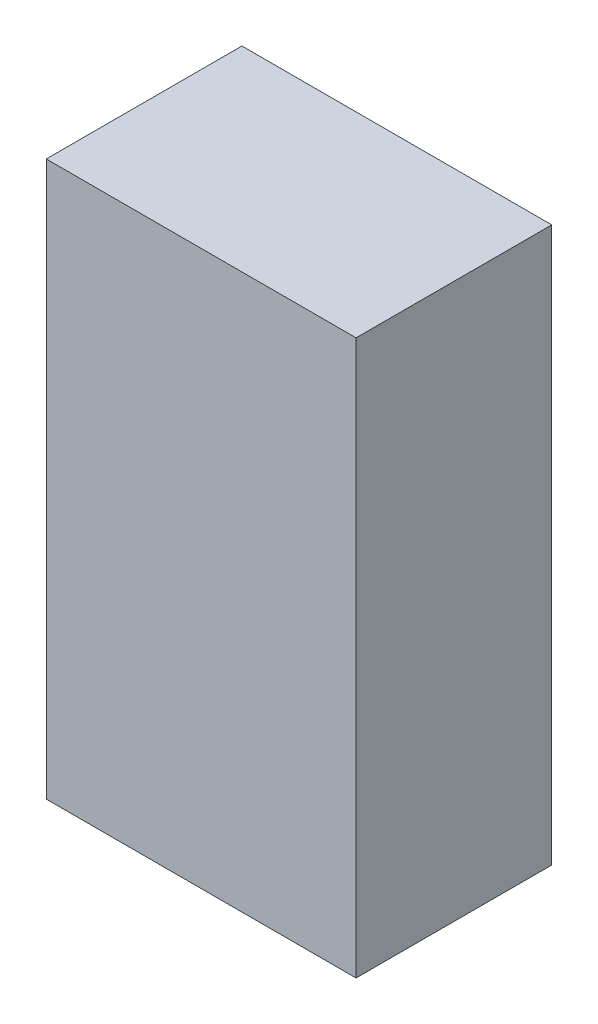
ISO-10303-21;
HEADER;
FILE_DESCRIPTION(('STEP AP214'),'2;1');
FILE_NAME('part.step','',(''),(''),'','','');
FILE_SCHEMA(('AUTOMOTIVE_DESIGN { 1 0 10303 214 1 1 1 1 }'));
ENDSEC;
DATA;
#1=APPLICATION_CONTEXT('core data for automotive mechanical design processes');
#2=APPLICATION_PROTOCOL_DEFINITION('international standard','automotive_design',2000,#1);
#3=PRODUCT_CONTEXT('',#1,'mechanical');
#4=PRODUCT('Part','Part','',(#3));
#5=PRODUCT_RELATED_PRODUCT_CATEGORY('part','',(#4));
#6=PRODUCT_DEFINITION_FORMATION('','',#4);
#7=PRODUCT_DEFINITION_CONTEXT('part definition',#1,'design');
#8=PRODUCT_DEFINITION('design','',#6,#7);
#9=PRODUCT_DEFINITION_SHAPE('','',#8);
#10=(LENGTH_UNIT() NAMED_UNIT(*) SI_UNIT(.MILLI.,.METRE.));
#11=(NAMED_UNIT(*) PLANE_ANGLE_UNIT() SI_UNIT($,.RADIAN.));
#12=(NAMED_UNIT(*) SI_UNIT($,.STERADIAN.) SOLID_ANGLE_UNIT());
#13=UNCERTAINTY_MEASURE_WITH_UNIT(LENGTH_MEASURE(1.E-05),#10,'distance_accuracy_value','');
#14=(GEOMETRIC_REPRESENTATION_CONTEXT(3) GLOBAL_UNCERTAINTY_ASSIGNED_CONTEXT((#13)) GLOBAL_UNIT_ASSIGNED_CONTEXT((#10,
#11,#12)) REPRESENTATION_CONTEXT('',''));
#15=CARTESIAN_POINT('',(0.,0.,0.));
#16=DIRECTION('',(0.,0.,1.));
#17=DIRECTION('',(1.,0.,0.));
#18=AXIS2_PLACEMENT_3D('',#15,#16,#17);
#19=CARTESIAN_POINT('',(0.47500032,0.85000084,0.6));
#20=DIRECTION('',(0.,0.,1.));
#21=DIRECTION('',(1.,0.,0.));
#22=AXIS2_PLACEMENT_3D('',#19,#20,#21);
#23=PLANE('',#22);
#24=DIRECTION('',(0.,1.,0.));
#25=VECTOR('',#24,1.);
#26=CARTESIAN_POINT('',(-0.47500032,-0.85000084,0.6));
#27=LINE('',#26,#25);
#28=CARTESIAN_POINT('',(-0.47500032,-0.85000084,0.6));
#29=VERTEX_POINT('',#28);
#30=CARTESIAN_POINT('',(-0.47500032,0.85000084,0.6));
#31=VERTEX_POINT('',#30);
#32=EDGE_CURVE('E58',#29,#31,#27,.T.);
#33=ORIENTED_EDGE('',*,*,#32,.F.);
#34=DIRECTION('',(1.,0.,0.));
#35=VECTOR('',#34,1.);
#36=CARTESIAN_POINT('',(0.47500032,-0.85000084,0.6));
#37=LINE('',#36,#35);
#38=CARTESIAN_POINT('',(0.47500032,-0.85000084,0.6));
#39=VERTEX_POINT('',#38);
#40=EDGE_CURVE('E53',#39,#29,#37,.F.);
#41=ORIENTED_EDGE('',*,*,#40,.F.);
#42=DIRECTION('',(0.,1.,0.));
#43=VECTOR('',#42,1.);
#44=CARTESIAN_POINT('',(0.47500032,0.85000084,0.6));
#45=LINE('',#44,#43);
#46=CARTESIAN_POINT('',(0.47500032,0.85000084,0.6));
#47=VERTEX_POINT('',#46);
#48=EDGE_CURVE('E68',#47,#39,#45,.F.);
#49=ORIENTED_EDGE('',*,*,#48,.F.);
#50=DIRECTION('',(1.,0.,0.));
#51=VECTOR('',#50,1.);
#52=CARTESIAN_POINT('',(-0.47500032,0.85000084,0.6));
#53=LINE('',#52,#51);
#54=EDGE_CURVE('E20',#31,#47,#53,.T.);
#55=ORIENTED_EDGE('',*,*,#54,.F.);
#56=EDGE_LOOP('',(#33,#41,#49,#55));
#57=FACE_BOUND('',#56,.T.);
#58=ADVANCED_FACE('F17',(#57),#23,.T.);
#59=CARTESIAN_POINT('',(-0.47500032,0.85000084,0.));
#60=DIRECTION('',(0.,1.,0.));
#61=DIRECTION('',(0.,0.,1.));
#62=AXIS2_PLACEMENT_3D('',#59,#60,#61);
#63=PLANE('',#62);
#64=DIRECTION('',(0.,0.,-1.));
#65=VECTOR('',#64,1.);
#66=CARTESIAN_POINT('',(0.47500032,0.85000084,0.));
#67=LINE('',#66,#65);
#68=CARTESIAN_POINT('',(0.47500032,0.85000084,0.));
#69=VERTEX_POINT('',#68);
#70=EDGE_CURVE('E79',#69,#47,#67,.F.);
#71=ORIENTED_EDGE('',*,*,#70,.F.);
#72=DIRECTION('',(1.,0.,0.));
#73=VECTOR('',#72,1.);
#74=CARTESIAN_POINT('',(0.47500032,0.85000084,0.));
#75=LINE('',#74,#73);
#76=CARTESIAN_POINT('',(-0.47500032,0.85000084,0.));
#77=VERTEX_POINT('',#76);
#78=EDGE_CURVE('E74',#69,#77,#75,.F.);
#79=ORIENTED_EDGE('',*,*,#78,.T.);
#80=DIRECTION('',(0.,0.,1.));
#81=VECTOR('',#80,1.);
#82=CARTESIAN_POINT('',(-0.47500032,0.85000084,0.));
#83=LINE('',#82,#81);
#84=EDGE_CURVE('E63',#31,#77,#83,.F.);
#85=ORIENTED_EDGE('',*,*,#84,.F.);
#86=ORIENTED_EDGE('',*,*,#54,.T.);
#87=EDGE_LOOP('',(#71,#79,#85,#86));
#88=FACE_BOUND('',#87,.T.);
#89=ADVANCED_FACE('F73',(#88),#63,.T.);
#90=CARTESIAN_POINT('',(-0.47500032,-0.85000084,0.));
#91=DIRECTION('',(-1.,0.,0.));
#92=DIRECTION('',(0.,0.,1.));
#93=AXIS2_PLACEMENT_3D('',#90,#91,#92);
#94=PLANE('',#93);
#95=ORIENTED_EDGE('',*,*,#84,.T.);
#96=DIRECTION('',(0.,1.,0.));
#97=VECTOR('',#96,1.);
#98=CARTESIAN_POINT('',(-0.47500032,0.85000084,0.));
#99=LINE('',#98,#97);
#100=CARTESIAN_POINT('',(-0.47500032,-0.85000084,0.));
#101=VERTEX_POINT('',#100);
#102=EDGE_CURVE('E84',#77,#101,#99,.F.);
#103=ORIENTED_EDGE('',*,*,#102,.T.);
#104=DIRECTION('',(0.,0.,-1.));
#105=VECTOR('',#104,1.);
#106=CARTESIAN_POINT('',(-0.47500032,-0.85000084,0.));
#107=LINE('',#106,#105);
#108=EDGE_CURVE('E65',#29,#101,#107,.T.);
#109=ORIENTED_EDGE('',*,*,#108,.F.);
#110=ORIENTED_EDGE('',*,*,#32,.T.);
#111=EDGE_LOOP('',(#95,#103,#109,#110));
#112=FACE_BOUND('',#111,.T.);
#113=ADVANCED_FACE('F60',(#112),#94,.T.);
#114=CARTESIAN_POINT('',(0.47500032,-0.85000084,0.));
#115=DIRECTION('',(0.,-1.,0.));
#116=DIRECTION('',(0.,0.,-1.));
#117=AXIS2_PLACEMENT_3D('',#114,#115,#116);
#118=PLANE('',#117);
#119=ORIENTED_EDGE('',*,*,#108,.T.);
#120=DIRECTION('',(1.,0.,0.));
#121=VECTOR('',#120,1.);
#122=CARTESIAN_POINT('',(0.47500032,-0.85000084,0.));
#123=LINE('',#122,#121);
#124=CARTESIAN_POINT('',(0.47500032,-0.85000084,0.));
#125=VERTEX_POINT('',#124);
#126=EDGE_CURVE('E26',#101,#125,#123,.T.);
#127=ORIENTED_EDGE('',*,*,#126,.T.);
#128=DIRECTION('',(0.,0.,-1.));
#129=VECTOR('',#128,1.);
#130=CARTESIAN_POINT('',(0.47500032,-0.85000084,0.));
#131=LINE('',#130,#129);
#132=EDGE_CURVE('E34',#39,#125,#131,.T.);
#133=ORIENTED_EDGE('',*,*,#132,.F.);
#134=ORIENTED_EDGE('',*,*,#40,.T.);
#135=EDGE_LOOP('',(#119,#127,#133,#134));
#136=FACE_BOUND('',#135,.T.);
#137=ADVANCED_FACE('F88',(#136),#118,.T.);
#138=CARTESIAN_POINT('',(0.47500032,0.85000084,0.));
#139=DIRECTION('',(1.,0.,0.));
#140=DIRECTION('',(0.,0.,-1.));
#141=AXIS2_PLACEMENT_3D('',#138,#139,#140);
#142=PLANE('',#141);
#143=ORIENTED_EDGE('',*,*,#132,.T.);
#144=DIRECTION('',(0.,1.,0.));
#145=VECTOR('',#144,1.);
#146=CARTESIAN_POINT('',(0.47500032,0.85000084,0.));
#147=LINE('',#146,#145);
#148=EDGE_CURVE('E11',#125,#69,#147,.T.);
#149=ORIENTED_EDGE('',*,*,#148,.T.);
#150=ORIENTED_EDGE('',*,*,#70,.T.);
#151=ORIENTED_EDGE('',*,*,#48,.T.);
#152=EDGE_LOOP('',(#143,#149,#150,#151));
#153=FACE_BOUND('',#152,.T.);
#154=ADVANCED_FACE('F91',(#153),#142,.T.);
#155=CARTESIAN_POINT('',(0.47500032,0.85000084,0.));
#156=DIRECTION('',(0.,0.,1.));
#157=DIRECTION('',(1.,0.,0.));
#158=AXIS2_PLACEMENT_3D('',#155,#156,#157);
#159=PLANE('',#158);
#160=ORIENTED_EDGE('',*,*,#126,.F.);
#161=ORIENTED_EDGE('',*,*,#102,.F.);
#162=ORIENTED_EDGE('',*,*,#78,.F.);
#163=ORIENTED_EDGE('',*,*,#148,.F.);
#164=EDGE_LOOP('',(#160,#161,#162,#163));
#165=FACE_BOUND('',#164,.T.);
#166=ADVANCED_FACE('F90',(#165),#159,.F.);
#167=CLOSED_SHELL('',(#58,#89,#113,#137,#154,#166));
#168=MANIFOLD_SOLID_BREP('B1',#167);
#169=ADVANCED_BREP_SHAPE_REPRESENTATION('',(#18,#168),#14);
#170=SHAPE_DEFINITION_REPRESENTATION(#9,#169);
ENDSEC;
END-ISO-10303-21;
